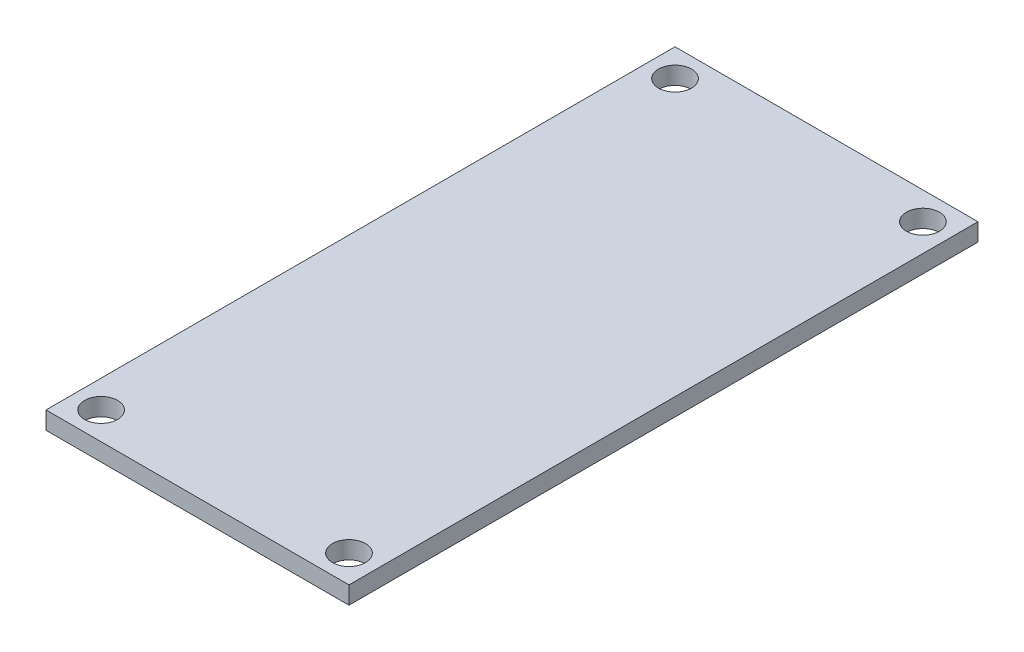
ISO-10303-21;
HEADER;
FILE_DESCRIPTION(('STEP AP214'),'2;1');
FILE_NAME('part.step','',(''),(''),'','','');
FILE_SCHEMA(('AUTOMOTIVE_DESIGN { 1 0 10303 214 1 1 1 1 }'));
ENDSEC;
DATA;
#1=APPLICATION_CONTEXT('core data for automotive mechanical design processes');
#2=APPLICATION_PROTOCOL_DEFINITION('international standard','automotive_design',2000,#1);
#3=PRODUCT_CONTEXT('',#1,'mechanical');
#4=PRODUCT('Part','Part','',(#3));
#5=PRODUCT_RELATED_PRODUCT_CATEGORY('part','',(#4));
#6=PRODUCT_DEFINITION_FORMATION('','',#4);
#7=PRODUCT_DEFINITION_CONTEXT('part definition',#1,'design');
#8=PRODUCT_DEFINITION('design','',#6,#7);
#9=PRODUCT_DEFINITION_SHAPE('','',#8);
#10=(LENGTH_UNIT() NAMED_UNIT(*) SI_UNIT(.MILLI.,.METRE.));
#11=(NAMED_UNIT(*) PLANE_ANGLE_UNIT() SI_UNIT($,.RADIAN.));
#12=(NAMED_UNIT(*) SI_UNIT($,.STERADIAN.) SOLID_ANGLE_UNIT());
#13=UNCERTAINTY_MEASURE_WITH_UNIT(LENGTH_MEASURE(1.E-05),#10,'distance_accuracy_value','');
#14=(GEOMETRIC_REPRESENTATION_CONTEXT(3) GLOBAL_UNCERTAINTY_ASSIGNED_CONTEXT((#13)) GLOBAL_UNIT_ASSIGNED_CONTEXT((#10,
#11,#12)) REPRESENTATION_CONTEXT('',''));
#15=CARTESIAN_POINT('',(0.,0.,0.));
#16=DIRECTION('',(0.,0.,1.));
#17=DIRECTION('',(1.,0.,0.));
#18=AXIS2_PLACEMENT_3D('',#15,#16,#17);
#19=CARTESIAN_POINT('',(0.,1.6,0.));
#20=DIRECTION('',(0.,-1.,0.));
#21=DIRECTION('',(0.,0.,-1.));
#22=AXIS2_PLACEMENT_3D('',#19,#20,#21);
#23=PLANE('',#22);
#24=DIRECTION('',(0.,0.,-1.));
#25=VECTOR('',#24,1.);
#26=CARTESIAN_POINT('',(13.75,1.6,28.545));
#27=LINE('',#26,#25);
#28=CARTESIAN_POINT('',(13.75,1.6,28.545));
#29=VERTEX_POINT('',#28);
#30=CARTESIAN_POINT('',(13.75,1.6,-28.545));
#31=VERTEX_POINT('',#30);
#32=EDGE_CURVE('E85',#29,#31,#27,.T.);
#33=ORIENTED_EDGE('',*,*,#32,.T.);
#34=DIRECTION('',(-1.,0.,0.));
#35=VECTOR('',#34,1.);
#36=CARTESIAN_POINT('',(-13.75,1.6,-28.545));
#37=LINE('',#36,#35);
#38=CARTESIAN_POINT('',(-13.75,1.6,-28.545));
#39=VERTEX_POINT('',#38);
#40=EDGE_CURVE('E80',#31,#39,#37,.T.);
#41=ORIENTED_EDGE('',*,*,#40,.T.);
#42=DIRECTION('',(0.,0.,1.));
#43=VECTOR('',#42,1.);
#44=CARTESIAN_POINT('',(-13.75,1.6,28.545));
#45=LINE('',#44,#43);
#46=CARTESIAN_POINT('',(-13.75,1.6,28.545));
#47=VERTEX_POINT('',#46);
#48=EDGE_CURVE('E83',#39,#47,#45,.T.);
#49=ORIENTED_EDGE('',*,*,#48,.T.);
#50=DIRECTION('',(1.,0.,0.));
#51=VECTOR('',#50,1.);
#52=CARTESIAN_POINT('',(-13.75,1.6,28.545));
#53=LINE('',#52,#51);
#54=EDGE_CURVE('E50',#47,#29,#53,.T.);
#55=ORIENTED_EDGE('',*,*,#54,.T.);
#56=EDGE_LOOP('',(#33,#41,#49,#55));
#57=FACE_BOUND('',#56,.T.);
#58=CARTESIAN_POINT('',(-11.25,1.6,-26.045));
#59=DIRECTION('',(0.,1.,0.));
#60=DIRECTION('',(0.,0.,1.));
#61=AXIS2_PLACEMENT_3D('',#58,#59,#60);
#62=CIRCLE('',#61,1.5);
#63=CARTESIAN_POINT('',(-11.25,1.6,-24.545));
#64=VERTEX_POINT('',#63);
#65=EDGE_CURVE('E100',#64,#64,#62,.T.);
#66=ORIENTED_EDGE('',*,*,#65,.F.);
#67=EDGE_LOOP('',(#66));
#68=FACE_BOUND('',#67,.T.);
#69=CARTESIAN_POINT('',(-11.25,1.6,26.045));
#70=DIRECTION('',(0.,1.,0.));
#71=DIRECTION('',(0.,0.,-1.));
#72=AXIS2_PLACEMENT_3D('',#69,#70,#71);
#73=CIRCLE('',#72,1.5);
#74=CARTESIAN_POINT('',(-11.25,1.6,24.545));
#75=VERTEX_POINT('',#74);
#76=EDGE_CURVE('E115',#75,#75,#73,.T.);
#77=ORIENTED_EDGE('',*,*,#76,.F.);
#78=EDGE_LOOP('',(#77));
#79=FACE_BOUND('',#78,.T.);
#80=CARTESIAN_POINT('',(11.25,1.6,-26.045));
#81=DIRECTION('',(0.,1.,0.));
#82=DIRECTION('',(0.,0.,-1.));
#83=AXIS2_PLACEMENT_3D('',#80,#81,#82);
#84=CIRCLE('',#83,1.5);
#85=CARTESIAN_POINT('',(11.25,1.6,-27.545));
#86=VERTEX_POINT('',#85);
#87=EDGE_CURVE('E121',#86,#86,#84,.T.);
#88=ORIENTED_EDGE('',*,*,#87,.F.);
#89=EDGE_LOOP('',(#88));
#90=FACE_BOUND('',#89,.T.);
#91=CARTESIAN_POINT('',(11.25,1.6,26.045));
#92=DIRECTION('',(0.,1.,0.));
#93=DIRECTION('',(0.,0.,1.));
#94=AXIS2_PLACEMENT_3D('',#91,#92,#93);
#95=CIRCLE('',#94,1.5);
#96=CARTESIAN_POINT('',(11.25,1.6,27.545));
#97=VERTEX_POINT('',#96);
#98=EDGE_CURVE('E127',#97,#97,#95,.T.);
#99=ORIENTED_EDGE('',*,*,#98,.F.);
#100=EDGE_LOOP('',(#99));
#101=FACE_BOUND('',#100,.T.);
#102=ADVANCED_FACE('F33',(#57,#68,#79,#90,#101),#23,.F.);
#103=CARTESIAN_POINT('',(0.,0.,0.));
#104=DIRECTION('',(0.,-1.,0.));
#105=DIRECTION('',(0.,0.,-1.));
#106=AXIS2_PLACEMENT_3D('',#103,#104,#105);
#107=PLANE('',#106);
#108=CARTESIAN_POINT('',(11.25,0.,-26.045));
#109=DIRECTION('',(0.,1.,0.));
#110=DIRECTION('',(0.,0.,-1.));
#111=AXIS2_PLACEMENT_3D('',#108,#109,#110);
#112=CIRCLE('',#111,1.5);
#113=CARTESIAN_POINT('',(11.25,0.,-27.545));
#114=VERTEX_POINT('',#113);
#115=EDGE_CURVE('E124',#114,#114,#112,.T.);
#116=ORIENTED_EDGE('',*,*,#115,.T.);
#117=EDGE_LOOP('',(#116));
#118=FACE_BOUND('',#117,.T.);
#119=CARTESIAN_POINT('',(-11.25,0.,-26.045));
#120=DIRECTION('',(0.,1.,0.));
#121=DIRECTION('',(0.,0.,1.));
#122=AXIS2_PLACEMENT_3D('',#119,#120,#121);
#123=CIRCLE('',#122,1.5);
#124=CARTESIAN_POINT('',(-11.25,0.,-24.545));
#125=VERTEX_POINT('',#124);
#126=EDGE_CURVE('E112',#125,#125,#123,.T.);
#127=ORIENTED_EDGE('',*,*,#126,.T.);
#128=EDGE_LOOP('',(#127));
#129=FACE_BOUND('',#128,.T.);
#130=DIRECTION('',(0.,0.,-1.));
#131=VECTOR('',#130,1.);
#132=CARTESIAN_POINT('',(13.75,0.,28.545));
#133=LINE('',#132,#131);
#134=CARTESIAN_POINT('',(13.75,0.,28.545));
#135=VERTEX_POINT('',#134);
#136=CARTESIAN_POINT('',(13.75,0.,-28.545));
#137=VERTEX_POINT('',#136);
#138=EDGE_CURVE('E97',#135,#137,#133,.T.);
#139=ORIENTED_EDGE('',*,*,#138,.F.);
#140=DIRECTION('',(1.,0.,0.));
#141=VECTOR('',#140,1.);
#142=CARTESIAN_POINT('',(-13.75,0.,28.545));
#143=LINE('',#142,#141);
#144=CARTESIAN_POINT('',(-13.75,0.,28.545));
#145=VERTEX_POINT('',#144);
#146=EDGE_CURVE('E73',#145,#135,#143,.T.);
#147=ORIENTED_EDGE('',*,*,#146,.F.);
#148=DIRECTION('',(0.,0.,1.));
#149=VECTOR('',#148,1.);
#150=CARTESIAN_POINT('',(-13.75,0.,28.545));
#151=LINE('',#150,#149);
#152=CARTESIAN_POINT('',(-13.75,0.,-28.545));
#153=VERTEX_POINT('',#152);
#154=EDGE_CURVE('E67',#153,#145,#151,.T.);
#155=ORIENTED_EDGE('',*,*,#154,.F.);
#156=DIRECTION('',(-1.,0.,0.));
#157=VECTOR('',#156,1.);
#158=CARTESIAN_POINT('',(-13.75,0.,-28.545));
#159=LINE('',#158,#157);
#160=EDGE_CURVE('E89',#137,#153,#159,.T.);
#161=ORIENTED_EDGE('',*,*,#160,.F.);
#162=EDGE_LOOP('',(#139,#147,#155,#161));
#163=FACE_BOUND('',#162,.T.);
#164=CARTESIAN_POINT('',(-11.25,0.,26.045));
#165=DIRECTION('',(0.,1.,0.));
#166=DIRECTION('',(0.,0.,-1.));
#167=AXIS2_PLACEMENT_3D('',#164,#165,#166);
#168=CIRCLE('',#167,1.5);
#169=CARTESIAN_POINT('',(-11.25,0.,24.545));
#170=VERTEX_POINT('',#169);
#171=EDGE_CURVE('E118',#170,#170,#168,.T.);
#172=ORIENTED_EDGE('',*,*,#171,.T.);
#173=EDGE_LOOP('',(#172));
#174=FACE_BOUND('',#173,.T.);
#175=CARTESIAN_POINT('',(11.25,0.,26.045));
#176=DIRECTION('',(0.,1.,0.));
#177=DIRECTION('',(0.,0.,1.));
#178=AXIS2_PLACEMENT_3D('',#175,#176,#177);
#179=CIRCLE('',#178,1.5);
#180=CARTESIAN_POINT('',(11.25,0.,27.545));
#181=VERTEX_POINT('',#180);
#182=EDGE_CURVE('E130',#181,#181,#179,.T.);
#183=ORIENTED_EDGE('',*,*,#182,.T.);
#184=EDGE_LOOP('',(#183));
#185=FACE_BOUND('',#184,.T.);
#186=ADVANCED_FACE('F108',(#118,#129,#163,#174,#185),#107,.T.);
#187=CARTESIAN_POINT('',(13.75,1.6,28.545));
#188=DIRECTION('',(-1.,0.,0.));
#189=DIRECTION('',(0.,0.,1.));
#190=AXIS2_PLACEMENT_3D('',#187,#188,#189);
#191=PLANE('',#190);
#192=ORIENTED_EDGE('',*,*,#138,.T.);
#193=DIRECTION('',(0.,-1.,0.));
#194=VECTOR('',#193,1.);
#195=CARTESIAN_POINT('',(13.75,1.6,-28.545));
#196=LINE('',#195,#194);
#197=EDGE_CURVE('E11',#31,#137,#196,.T.);
#198=ORIENTED_EDGE('',*,*,#197,.F.);
#199=ORIENTED_EDGE('',*,*,#32,.F.);
#200=DIRECTION('',(0.,-1.,0.));
#201=VECTOR('',#200,1.);
#202=CARTESIAN_POINT('',(13.75,1.6,28.545));
#203=LINE('',#202,#201);
#204=EDGE_CURVE('E93',#29,#135,#203,.T.);
#205=ORIENTED_EDGE('',*,*,#204,.T.);
#206=EDGE_LOOP('',(#192,#198,#199,#205));
#207=FACE_BOUND('',#206,.T.);
#208=ADVANCED_FACE('F35',(#207),#191,.F.);
#209=CARTESIAN_POINT('',(-13.75,1.6,-28.545));
#210=DIRECTION('',(0.,0.,1.));
#211=DIRECTION('',(1.,0.,0.));
#212=AXIS2_PLACEMENT_3D('',#209,#210,#211);
#213=PLANE('',#212);
#214=ORIENTED_EDGE('',*,*,#160,.T.);
#215=DIRECTION('',(0.,-1.,0.));
#216=VECTOR('',#215,1.);
#217=CARTESIAN_POINT('',(-13.75,1.6,-28.545));
#218=LINE('',#217,#216);
#219=EDGE_CURVE('E42',#39,#153,#218,.T.);
#220=ORIENTED_EDGE('',*,*,#219,.F.);
#221=ORIENTED_EDGE('',*,*,#40,.F.);
#222=ORIENTED_EDGE('',*,*,#197,.T.);
#223=EDGE_LOOP('',(#214,#220,#221,#222));
#224=FACE_BOUND('',#223,.T.);
#225=ADVANCED_FACE('F88',(#224),#213,.F.);
#226=CARTESIAN_POINT('',(-13.75,1.6,28.545));
#227=DIRECTION('',(1.,0.,0.));
#228=DIRECTION('',(0.,0.,-1.));
#229=AXIS2_PLACEMENT_3D('',#226,#227,#228);
#230=PLANE('',#229);
#231=ORIENTED_EDGE('',*,*,#154,.T.);
#232=DIRECTION('',(0.,-1.,0.));
#233=VECTOR('',#232,1.);
#234=CARTESIAN_POINT('',(-13.75,1.6,28.545));
#235=LINE('',#234,#233);
#236=EDGE_CURVE('E90',#47,#145,#235,.T.);
#237=ORIENTED_EDGE('',*,*,#236,.F.);
#238=ORIENTED_EDGE('',*,*,#48,.F.);
#239=ORIENTED_EDGE('',*,*,#219,.T.);
#240=EDGE_LOOP('',(#231,#237,#238,#239));
#241=FACE_BOUND('',#240,.T.);
#242=ADVANCED_FACE('F91',(#241),#230,.F.);
#243=CARTESIAN_POINT('',(-13.75,1.6,28.545));
#244=DIRECTION('',(0.,0.,-1.));
#245=DIRECTION('',(-1.,0.,0.));
#246=AXIS2_PLACEMENT_3D('',#243,#244,#245);
#247=PLANE('',#246);
#248=ORIENTED_EDGE('',*,*,#146,.T.);
#249=ORIENTED_EDGE('',*,*,#204,.F.);
#250=ORIENTED_EDGE('',*,*,#54,.F.);
#251=ORIENTED_EDGE('',*,*,#236,.T.);
#252=EDGE_LOOP('',(#248,#249,#250,#251));
#253=FACE_BOUND('',#252,.T.);
#254=ADVANCED_FACE('F105',(#253),#247,.F.);
#255=CARTESIAN_POINT('',(-11.25,1.6,-26.045));
#256=DIRECTION('',(0.,-1.,0.));
#257=DIRECTION('',(0.,0.,-1.));
#258=AXIS2_PLACEMENT_3D('',#255,#256,#257);
#259=CYLINDRICAL_SURFACE('',#258,1.5);
#260=ORIENTED_EDGE('',*,*,#65,.T.);
#261=EDGE_LOOP('',(#260));
#262=FACE_BOUND('',#261,.T.);
#263=ORIENTED_EDGE('',*,*,#126,.F.);
#264=EDGE_LOOP('',(#263));
#265=FACE_BOUND('',#264,.T.);
#266=ADVANCED_FACE('F147',(#262,#265),#259,.F.);
#267=CARTESIAN_POINT('',(-11.25,1.6,26.045));
#268=DIRECTION('',(0.,-1.,0.));
#269=DIRECTION('',(0.,0.,-1.));
#270=AXIS2_PLACEMENT_3D('',#267,#268,#269);
#271=CYLINDRICAL_SURFACE('',#270,1.5);
#272=ORIENTED_EDGE('',*,*,#76,.T.);
#273=EDGE_LOOP('',(#272));
#274=FACE_BOUND('',#273,.T.);
#275=ORIENTED_EDGE('',*,*,#171,.F.);
#276=EDGE_LOOP('',(#275));
#277=FACE_BOUND('',#276,.T.);
#278=ADVANCED_FACE('F193',(#274,#277),#271,.F.);
#279=CARTESIAN_POINT('',(11.25,1.6,-26.045));
#280=DIRECTION('',(0.,-1.,0.));
#281=DIRECTION('',(0.,0.,-1.));
#282=AXIS2_PLACEMENT_3D('',#279,#280,#281);
#283=CYLINDRICAL_SURFACE('',#282,1.5);
#284=ORIENTED_EDGE('',*,*,#87,.T.);
#285=EDGE_LOOP('',(#284));
#286=FACE_BOUND('',#285,.T.);
#287=ORIENTED_EDGE('',*,*,#115,.F.);
#288=EDGE_LOOP('',(#287));
#289=FACE_BOUND('',#288,.T.);
#290=ADVANCED_FACE('F201',(#286,#289),#283,.F.);
#291=CARTESIAN_POINT('',(11.25,1.6,26.045));
#292=DIRECTION('',(0.,-1.,0.));
#293=DIRECTION('',(0.,0.,-1.));
#294=AXIS2_PLACEMENT_3D('',#291,#292,#293);
#295=CYLINDRICAL_SURFACE('',#294,1.5);
#296=ORIENTED_EDGE('',*,*,#98,.T.);
#297=EDGE_LOOP('',(#296));
#298=FACE_BOUND('',#297,.T.);
#299=ORIENTED_EDGE('',*,*,#182,.F.);
#300=EDGE_LOOP('',(#299));
#301=FACE_BOUND('',#300,.T.);
#302=ADVANCED_FACE('F136',(#298,#301),#295,.F.);
#303=CLOSED_SHELL('',(#102,#186,#208,#225,#242,#254,#266,#278,#290,#302));
#304=MANIFOLD_SOLID_BREP('B2',#303);
#305=ADVANCED_BREP_SHAPE_REPRESENTATION('',(#18,#304),#14);
#306=SHAPE_DEFINITION_REPRESENTATION(#9,#305);
ENDSEC;
END-ISO-10303-21;
